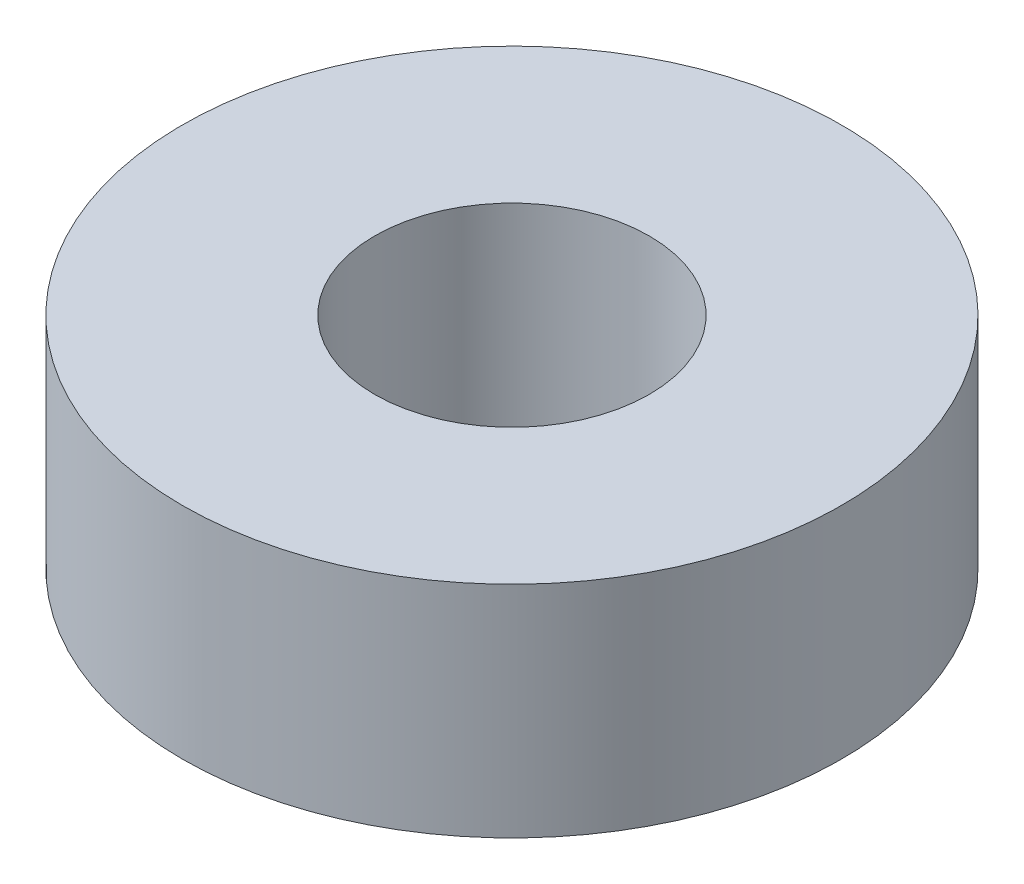
ISO-10303-21;
HEADER;
FILE_DESCRIPTION(('STEP AP214'),'2;1');
FILE_NAME('part.step','',(''),(''),'','','');
FILE_SCHEMA(('AUTOMOTIVE_DESIGN { 1 0 10303 214 1 1 1 1 }'));
ENDSEC;
DATA;
#1=APPLICATION_CONTEXT('core data for automotive mechanical design processes');
#2=APPLICATION_PROTOCOL_DEFINITION('international standard','automotive_design',2000,#1);
#3=PRODUCT_CONTEXT('',#1,'mechanical');
#4=PRODUCT('Part','Part','',(#3));
#5=PRODUCT_RELATED_PRODUCT_CATEGORY('part','',(#4));
#6=PRODUCT_DEFINITION_FORMATION('','',#4);
#7=PRODUCT_DEFINITION_CONTEXT('part definition',#1,'design');
#8=PRODUCT_DEFINITION('design','',#6,#7);
#9=PRODUCT_DEFINITION_SHAPE('','',#8);
#10=(LENGTH_UNIT() NAMED_UNIT(*) SI_UNIT(.MILLI.,.METRE.));
#11=(NAMED_UNIT(*) PLANE_ANGLE_UNIT() SI_UNIT($,.RADIAN.));
#12=(NAMED_UNIT(*) SI_UNIT($,.STERADIAN.) SOLID_ANGLE_UNIT());
#13=UNCERTAINTY_MEASURE_WITH_UNIT(LENGTH_MEASURE(1.E-05),#10,'distance_accuracy_value','');
#14=(GEOMETRIC_REPRESENTATION_CONTEXT(3) GLOBAL_UNCERTAINTY_ASSIGNED_CONTEXT((#13)) GLOBAL_UNIT_ASSIGNED_CONTEXT((#10,
#11,#12)) REPRESENTATION_CONTEXT('',''));
#15=CARTESIAN_POINT('',(0.,0.,0.));
#16=DIRECTION('',(0.,0.,1.));
#17=DIRECTION('',(1.,0.,0.));
#18=AXIS2_PLACEMENT_3D('',#15,#16,#17);
#19=CARTESIAN_POINT('',(0.,4.,0.));
#20=DIRECTION('',(0.,1.,0.));
#21=DIRECTION('',(0.,0.,1.));
#22=AXIS2_PLACEMENT_3D('',#19,#20,#21);
#23=PLANE('',#22);
#24=CARTESIAN_POINT('',(0.,4.,0.));
#25=DIRECTION('',(0.,1.,0.));
#26=DIRECTION('',(0.,0.,1.));
#27=AXIS2_PLACEMENT_3D('',#24,#25,#26);
#28=CIRCLE('',#27,6.);
#29=CARTESIAN_POINT('',(0.,4.,6.));
#30=VERTEX_POINT('',#29);
#31=EDGE_CURVE('E10',#30,#30,#28,.T.);
#32=ORIENTED_EDGE('',*,*,#31,.T.);
#33=EDGE_LOOP('',(#32));
#34=FACE_BOUND('',#33,.T.);
#35=CARTESIAN_POINT('',(0.,4.,0.));
#36=DIRECTION('',(0.,1.,0.));
#37=DIRECTION('',(0.,0.,1.));
#38=AXIS2_PLACEMENT_3D('',#35,#36,#37);
#39=CIRCLE('',#38,2.5);
#40=CARTESIAN_POINT('',(0.,4.,2.5));
#41=VERTEX_POINT('',#40);
#42=EDGE_CURVE('E54',#41,#41,#39,.T.);
#43=ORIENTED_EDGE('',*,*,#42,.F.);
#44=EDGE_LOOP('',(#43));
#45=FACE_BOUND('',#44,.T.);
#46=ADVANCED_FACE('F41',(#34,#45),#23,.T.);
#47=CARTESIAN_POINT('',(0.,0.,0.));
#48=DIRECTION('',(0.,1.,0.));
#49=DIRECTION('',(0.,0.,1.));
#50=AXIS2_PLACEMENT_3D('',#47,#48,#49);
#51=PLANE('',#50);
#52=CARTESIAN_POINT('',(0.,0.,0.));
#53=DIRECTION('',(0.,1.,0.));
#54=DIRECTION('',(0.,0.,1.));
#55=AXIS2_PLACEMENT_3D('',#52,#53,#54);
#56=CIRCLE('',#55,6.);
#57=CARTESIAN_POINT('',(0.,0.,6.));
#58=VERTEX_POINT('',#57);
#59=EDGE_CURVE('E45',#58,#58,#56,.T.);
#60=ORIENTED_EDGE('',*,*,#59,.F.);
#61=EDGE_LOOP('',(#60));
#62=FACE_BOUND('',#61,.T.);
#63=CARTESIAN_POINT('',(0.,0.,0.));
#64=DIRECTION('',(0.,1.,0.));
#65=DIRECTION('',(0.,0.,1.));
#66=AXIS2_PLACEMENT_3D('',#63,#64,#65);
#67=CIRCLE('',#66,2.5);
#68=CARTESIAN_POINT('',(0.,0.,2.5));
#69=VERTEX_POINT('',#68);
#70=EDGE_CURVE('E56',#69,#69,#67,.T.);
#71=ORIENTED_EDGE('',*,*,#70,.T.);
#72=EDGE_LOOP('',(#71));
#73=FACE_BOUND('',#72,.T.);
#74=ADVANCED_FACE('F68',(#62,#73),#51,.F.);
#75=CARTESIAN_POINT('',(0.,4.,0.));
#76=DIRECTION('',(0.,-1.,0.));
#77=DIRECTION('',(0.,0.,-1.));
#78=AXIS2_PLACEMENT_3D('',#75,#76,#77);
#79=CYLINDRICAL_SURFACE('',#78,6.);
#80=ORIENTED_EDGE('',*,*,#31,.F.);
#81=EDGE_LOOP('',(#80));
#82=FACE_BOUND('',#81,.T.);
#83=ORIENTED_EDGE('',*,*,#59,.T.);
#84=EDGE_LOOP('',(#83));
#85=FACE_BOUND('',#84,.T.);
#86=ADVANCED_FACE('F43',(#82,#85),#79,.T.);
#87=CARTESIAN_POINT('',(0.,4.,0.));
#88=DIRECTION('',(0.,-1.,0.));
#89=DIRECTION('',(0.,0.,-1.));
#90=AXIS2_PLACEMENT_3D('',#87,#88,#89);
#91=CYLINDRICAL_SURFACE('',#90,2.5);
#92=ORIENTED_EDGE('',*,*,#42,.T.);
#93=EDGE_LOOP('',(#92));
#94=FACE_BOUND('',#93,.T.);
#95=ORIENTED_EDGE('',*,*,#70,.F.);
#96=EDGE_LOOP('',(#95));
#97=FACE_BOUND('',#96,.T.);
#98=ADVANCED_FACE('F64',(#94,#97),#91,.F.);
#99=CLOSED_SHELL('',(#46,#74,#86,#98));
#100=MANIFOLD_SOLID_BREP('B2',#99);
#101=ADVANCED_BREP_SHAPE_REPRESENTATION('',(#18,#100),#14);
#102=SHAPE_DEFINITION_REPRESENTATION(#9,#101);
ENDSEC;
END-ISO-10303-21;
